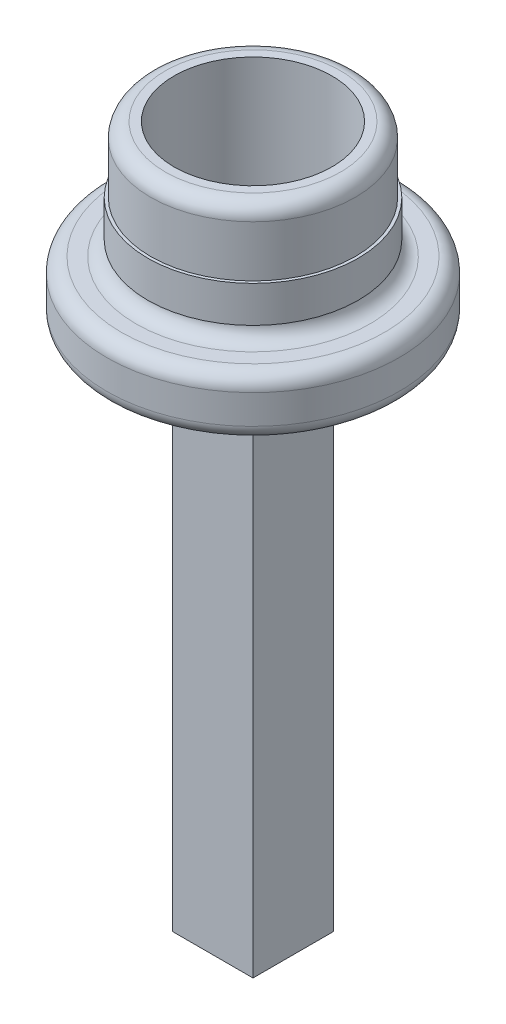
ISO-10303-21;
HEADER;
FILE_DESCRIPTION(('STEP AP214'),'2;1');
FILE_NAME('part.step','',(''),(''),'','','');
FILE_SCHEMA(('AUTOMOTIVE_DESIGN { 1 0 10303 214 1 1 1 1 }'));
ENDSEC;
DATA;
#1=APPLICATION_CONTEXT('core data for automotive mechanical design processes');
#2=APPLICATION_PROTOCOL_DEFINITION('international standard','automotive_design',2000,#1);
#3=PRODUCT_CONTEXT('',#1,'mechanical');
#4=PRODUCT('Part','Part','',(#3));
#5=PRODUCT_RELATED_PRODUCT_CATEGORY('part','',(#4));
#6=PRODUCT_DEFINITION_FORMATION('','',#4);
#7=PRODUCT_DEFINITION_CONTEXT('part definition',#1,'design');
#8=PRODUCT_DEFINITION('design','',#6,#7);
#9=PRODUCT_DEFINITION_SHAPE('','',#8);
#10=(LENGTH_UNIT() NAMED_UNIT(*) SI_UNIT(.MILLI.,.METRE.));
#11=(NAMED_UNIT(*) PLANE_ANGLE_UNIT() SI_UNIT($,.RADIAN.));
#12=(NAMED_UNIT(*) SI_UNIT($,.STERADIAN.) SOLID_ANGLE_UNIT());
#13=UNCERTAINTY_MEASURE_WITH_UNIT(LENGTH_MEASURE(1.E-05),#10,'distance_accuracy_value','');
#14=(GEOMETRIC_REPRESENTATION_CONTEXT(3) GLOBAL_UNCERTAINTY_ASSIGNED_CONTEXT((#13)) GLOBAL_UNIT_ASSIGNED_CONTEXT((#10,
#11,#12)) REPRESENTATION_CONTEXT('',''));
#15=CARTESIAN_POINT('',(0.,0.,0.));
#16=DIRECTION('',(0.,0.,1.));
#17=DIRECTION('',(1.,0.,0.));
#18=AXIS2_PLACEMENT_3D('',#15,#16,#17);
#19=CARTESIAN_POINT('',(-5.93361483411232E-06,-2.56436574363047,-1.69584897440673E-05));
#20=DIRECTION('',(0.,1.,0.));
#21=DIRECTION('',(0.,0.,1.));
#22=AXIS2_PLACEMENT_3D('',#19,#20,#21);
#23=PLANE('',#22);
#24=CARTESIAN_POINT('',(-5.93361483411232E-06,-2.56436574363047,-1.69584897440673E-05));
#25=DIRECTION('',(0.,1.,0.));
#26=DIRECTION('',(0.,0.,1.));
#27=AXIS2_PLACEMENT_3D('',#24,#25,#26);
#28=CIRCLE('',#27,18.);
#29=CARTESIAN_POINT('',(-5.93361483411232E-06,-2.56436574363047,17.9999830415103));
#30=VERTEX_POINT('',#29);
#31=EDGE_CURVE('E170',#30,#30,#28,.F.);
#32=ORIENTED_EDGE('',*,*,#31,.T.);
#33=EDGE_LOOP('',(#32));
#34=FACE_BOUND('',#33,.T.);
#35=DIRECTION('',(0.,0.,1.));
#36=VECTOR('',#35,1.);
#37=CARTESIAN_POINT('',(5.49999406638516,-2.56436574363047,5.49998304151026));
#38=LINE('',#37,#36);
#39=CARTESIAN_POINT('',(5.49999406638517,-2.56436574363047,-5.50001695848974));
#40=VERTEX_POINT('',#39);
#41=CARTESIAN_POINT('',(5.49999406638516,-2.56436574363047,5.49998304151026));
#42=VERTEX_POINT('',#41);
#43=EDGE_CURVE('E134',#40,#42,#38,.T.);
#44=ORIENTED_EDGE('',*,*,#43,.F.);
#45=DIRECTION('',(1.,0.,0.));
#46=VECTOR('',#45,1.);
#47=CARTESIAN_POINT('',(-5.50000593361484,-2.56436574363047,-5.50001695848974));
#48=LINE('',#47,#46);
#49=CARTESIAN_POINT('',(-5.50000593361484,-2.56436574363047,-5.50001695848974));
#50=VERTEX_POINT('',#49);
#51=EDGE_CURVE('E242',#50,#40,#48,.T.);
#52=ORIENTED_EDGE('',*,*,#51,.F.);
#53=DIRECTION('',(0.,0.,-1.));
#54=VECTOR('',#53,1.);
#55=CARTESIAN_POINT('',(-5.50000593361484,-2.56436574363047,5.49998304151026));
#56=LINE('',#55,#54);
#57=CARTESIAN_POINT('',(-5.50000593361484,-2.56436574363047,5.49998304151026));
#58=VERTEX_POINT('',#57);
#59=EDGE_CURVE('E238',#58,#50,#56,.T.);
#60=ORIENTED_EDGE('',*,*,#59,.F.);
#61=DIRECTION('',(-1.,0.,0.));
#62=VECTOR('',#61,1.);
#63=CARTESIAN_POINT('',(-5.50000593361484,-2.56436574363047,5.49998304151026));
#64=LINE('',#63,#62);
#65=EDGE_CURVE('E235',#42,#58,#64,.T.);
#66=ORIENTED_EDGE('',*,*,#65,.F.);
#67=EDGE_LOOP('',(#44,#52,#60,#66));
#68=FACE_BOUND('',#67,.T.);
#69=ADVANCED_FACE('F73',(#34,#68),#23,.F.);
#70=CARTESIAN_POINT('',(-5.93361483411232E-06,5.43563425636953,-1.69584897440673E-05));
#71=DIRECTION('',(0.,-1.,0.));
#72=DIRECTION('',(0.,0.,-1.));
#73=AXIS2_PLACEMENT_3D('',#70,#71,#72);
#74=CYLINDRICAL_SURFACE('',#73,20.);
#75=CARTESIAN_POINT('',(-5.93361483411232E-06,-0.564365743630474,-1.69584897440673E-05));
#76=DIRECTION('',(0.,1.,0.));
#77=DIRECTION('',(0.,0.,1.));
#78=AXIS2_PLACEMENT_3D('',#75,#76,#77);
#79=CIRCLE('',#78,20.);
#80=CARTESIAN_POINT('',(-5.93361483411232E-06,-0.564365743630474,19.9999830415103));
#81=VERTEX_POINT('',#80);
#82=EDGE_CURVE('E166',#81,#81,#79,.T.);
#83=ORIENTED_EDGE('',*,*,#82,.T.);
#84=EDGE_LOOP('',(#83));
#85=FACE_BOUND('',#84,.T.);
#86=CARTESIAN_POINT('',(-5.93361483411232E-06,3.43563425636953,-1.69584897440673E-05));
#87=DIRECTION('',(0.,1.,0.));
#88=DIRECTION('',(0.,0.,1.));
#89=AXIS2_PLACEMENT_3D('',#86,#87,#88);
#90=CIRCLE('',#89,20.);
#91=CARTESIAN_POINT('',(-5.93361483411232E-06,3.43563425636953,19.9999830415103));
#92=VERTEX_POINT('',#91);
#93=EDGE_CURVE('E162',#92,#92,#90,.F.);
#94=ORIENTED_EDGE('',*,*,#93,.T.);
#95=EDGE_LOOP('',(#94));
#96=FACE_BOUND('',#95,.T.);
#97=ADVANCED_FACE('F263',(#85,#96),#74,.T.);
#98=CARTESIAN_POINT('',(-5.93361483411232E-06,5.43563425636953,-1.69584897440673E-05));
#99=DIRECTION('',(0.,1.,0.));
#100=DIRECTION('',(0.,0.,1.));
#101=AXIS2_PLACEMENT_3D('',#98,#99,#100);
#102=PLANE('',#101);
#103=CARTESIAN_POINT('',(-5.93361483411232E-06,5.43563425636953,-1.69584897440673E-05));
#104=DIRECTION('',(0.,1.,0.));
#105=DIRECTION('',(0.,0.,1.));
#106=AXIS2_PLACEMENT_3D('',#103,#104,#105);
#107=CIRCLE('',#106,16.);
#108=CARTESIAN_POINT('',(-5.93361483411232E-06,5.43563425636953,15.9999830415103));
#109=VERTEX_POINT('',#108);
#110=EDGE_CURVE('E158',#109,#109,#107,.F.);
#111=ORIENTED_EDGE('',*,*,#110,.T.);
#112=EDGE_LOOP('',(#111));
#113=FACE_BOUND('',#112,.T.);
#114=CARTESIAN_POINT('',(-5.93361483411232E-06,5.43563425636953,-1.69584897440673E-05));
#115=DIRECTION('',(0.,1.,0.));
#116=DIRECTION('',(0.,0.,1.));
#117=AXIS2_PLACEMENT_3D('',#114,#115,#116);
#118=CIRCLE('',#117,18.);
#119=CARTESIAN_POINT('',(-5.93361483411232E-06,5.43563425636953,17.9999830415103));
#120=VERTEX_POINT('',#119);
#121=EDGE_CURVE('E154',#120,#120,#118,.T.);
#122=ORIENTED_EDGE('',*,*,#121,.T.);
#123=EDGE_LOOP('',(#122));
#124=FACE_BOUND('',#123,.T.);
#125=ADVANCED_FACE('F269',(#113,#124),#102,.T.);
#126=CARTESIAN_POINT('',(5.49999406638516,-82.5643657436305,5.49998304151026));
#127=DIRECTION('',(-1.,0.,0.));
#128=DIRECTION('',(0.,0.,1.));
#129=AXIS2_PLACEMENT_3D('',#126,#127,#128);
#130=PLANE('',#129);
#131=DIRECTION('',(0.,1.,0.));
#132=VECTOR('',#131,1.);
#133=CARTESIAN_POINT('',(5.49999406638516,-82.5643657436305,5.49998304151026));
#134=LINE('',#133,#132);
#135=CARTESIAN_POINT('',(5.49999406638516,-74.5643657436305,5.49998304151026));
#136=VERTEX_POINT('',#135);
#137=EDGE_CURVE('E128',#136,#42,#134,.T.);
#138=ORIENTED_EDGE('',*,*,#137,.F.);
#139=DIRECTION('',(0.,0.,1.));
#140=VECTOR('',#139,1.);
#141=CARTESIAN_POINT('',(5.49999406638516,-74.5643657436305,-5.50001695848974));
#142=LINE('',#141,#140);
#143=CARTESIAN_POINT('',(5.49999406638516,-74.5643657436305,-5.50001695848974));
#144=VERTEX_POINT('',#143);
#145=EDGE_CURVE('E116',#144,#136,#142,.T.);
#146=ORIENTED_EDGE('',*,*,#145,.F.);
#147=DIRECTION('',(0.,1.,0.));
#148=VECTOR('',#147,1.);
#149=CARTESIAN_POINT('',(5.49999406638517,-82.5643657436305,-5.50001695848974));
#150=LINE('',#149,#148);
#151=EDGE_CURVE('E99',#144,#40,#150,.T.);
#152=ORIENTED_EDGE('',*,*,#151,.T.);
#153=ORIENTED_EDGE('',*,*,#43,.T.);
#154=EDGE_LOOP('',(#138,#146,#152,#153));
#155=FACE_BOUND('',#154,.T.);
#156=ADVANCED_FACE('F133',(#155),#130,.F.);
#157=CARTESIAN_POINT('',(-5.50000593361484,-82.5643657436305,5.49998304151026));
#158=DIRECTION('',(0.,0.,-1.));
#159=DIRECTION('',(-1.,0.,0.));
#160=AXIS2_PLACEMENT_3D('',#157,#158,#159);
#161=PLANE('',#160);
#162=DIRECTION('',(0.,1.,0.));
#163=VECTOR('',#162,1.);
#164=CARTESIAN_POINT('',(-5.50000593361484,-82.5643657436305,5.49998304151026));
#165=LINE('',#164,#163);
#166=CARTESIAN_POINT('',(-5.50000593361483,-74.5643657436305,5.49998304151026));
#167=VERTEX_POINT('',#166);
#168=EDGE_CURVE('E130',#167,#58,#165,.T.);
#169=ORIENTED_EDGE('',*,*,#168,.F.);
#170=DIRECTION('',(-1.,0.,0.));
#171=VECTOR('',#170,1.);
#172=CARTESIAN_POINT('',(-5.50000593361483,-74.5643657436305,5.49998304151026));
#173=LINE('',#172,#171);
#174=EDGE_CURVE('E119',#136,#167,#173,.T.);
#175=ORIENTED_EDGE('',*,*,#174,.F.);
#176=ORIENTED_EDGE('',*,*,#137,.T.);
#177=ORIENTED_EDGE('',*,*,#65,.T.);
#178=EDGE_LOOP('',(#169,#175,#176,#177));
#179=FACE_BOUND('',#178,.T.);
#180=ADVANCED_FACE('F126',(#179),#161,.F.);
#181=CARTESIAN_POINT('',(-5.50000593361484,-82.5643657436305,5.49998304151026));
#182=DIRECTION('',(1.,0.,0.));
#183=DIRECTION('',(0.,0.,-1.));
#184=AXIS2_PLACEMENT_3D('',#181,#182,#183);
#185=PLANE('',#184);
#186=DIRECTION('',(0.,1.,0.));
#187=VECTOR('',#186,1.);
#188=CARTESIAN_POINT('',(-5.50000593361484,-82.5643657436305,-5.50001695848974));
#189=LINE('',#188,#187);
#190=CARTESIAN_POINT('',(-5.50000593361484,-74.5643657436305,-5.50001695848974));
#191=VERTEX_POINT('',#190);
#192=EDGE_CURVE('E143',#191,#50,#189,.T.);
#193=ORIENTED_EDGE('',*,*,#192,.F.);
#194=DIRECTION('',(0.,0.,-1.));
#195=VECTOR('',#194,1.);
#196=CARTESIAN_POINT('',(-5.50000593361483,-74.5643657436305,-5.50001695848974));
#197=LINE('',#196,#195);
#198=EDGE_CURVE('E91',#167,#191,#197,.T.);
#199=ORIENTED_EDGE('',*,*,#198,.F.);
#200=ORIENTED_EDGE('',*,*,#168,.T.);
#201=ORIENTED_EDGE('',*,*,#59,.T.);
#202=EDGE_LOOP('',(#193,#199,#200,#201));
#203=FACE_BOUND('',#202,.T.);
#204=ADVANCED_FACE('F254',(#203),#185,.F.);
#205=CARTESIAN_POINT('',(-5.50000593361484,-82.5643657436305,-5.50001695848974));
#206=DIRECTION('',(0.,0.,1.));
#207=DIRECTION('',(1.,0.,0.));
#208=AXIS2_PLACEMENT_3D('',#205,#206,#207);
#209=PLANE('',#208);
#210=ORIENTED_EDGE('',*,*,#151,.F.);
#211=DIRECTION('',(1.,0.,0.));
#212=VECTOR('',#211,1.);
#213=CARTESIAN_POINT('',(-5.50000593361483,-74.5643657436305,-5.50001695848974));
#214=LINE('',#213,#212);
#215=EDGE_CURVE('E120',#191,#144,#214,.T.);
#216=ORIENTED_EDGE('',*,*,#215,.F.);
#217=ORIENTED_EDGE('',*,*,#192,.T.);
#218=ORIENTED_EDGE('',*,*,#51,.T.);
#219=EDGE_LOOP('',(#210,#216,#217,#218));
#220=FACE_BOUND('',#219,.T.);
#221=ADVANCED_FACE('F223',(#220),#209,.F.);
#222=CARTESIAN_POINT('',(-5.93361483411232E-06,7.43563425636953,-1.69584897440673E-05));
#223=DIRECTION('',(0.,1.,0.));
#224=DIRECTION('',(0.,0.,1.));
#225=AXIS2_PLACEMENT_3D('',#222,#223,#224);
#226=TOROIDAL_SURFACE('',#225,16.,2.);
#227=ORIENTED_EDGE('',*,*,#110,.F.);
#228=EDGE_LOOP('',(#227));
#229=FACE_BOUND('',#228,.T.);
#230=CARTESIAN_POINT('',(-5.93361483411232E-06,7.43563425636953,-1.69584897440673E-05));
#231=DIRECTION('',(0.,1.,0.));
#232=DIRECTION('',(0.,0.,1.));
#233=AXIS2_PLACEMENT_3D('',#230,#231,#232);
#234=CIRCLE('',#233,14.);
#235=CARTESIAN_POINT('',(-5.93361483411232E-06,7.43563425636953,13.9999830415103));
#236=VERTEX_POINT('',#235);
#237=EDGE_CURVE('E149',#236,#236,#234,.T.);
#238=ORIENTED_EDGE('',*,*,#237,.F.);
#239=EDGE_LOOP('',(#238));
#240=FACE_BOUND('',#239,.T.);
#241=ADVANCED_FACE('F260',(#229,#240),#226,.F.);
#242=CARTESIAN_POINT('',(-5.93361483411232E-06,-0.564365743630474,-1.69584897440673E-05));
#243=DIRECTION('',(0.,1.,0.));
#244=DIRECTION('',(0.,0.,1.));
#245=AXIS2_PLACEMENT_3D('',#242,#243,#244);
#246=TOROIDAL_SURFACE('',#245,18.,2.);
#247=ORIENTED_EDGE('',*,*,#31,.F.);
#248=EDGE_LOOP('',(#247));
#249=FACE_BOUND('',#248,.T.);
#250=ORIENTED_EDGE('',*,*,#82,.F.);
#251=EDGE_LOOP('',(#250));
#252=FACE_BOUND('',#251,.T.);
#253=ADVANCED_FACE('F277',(#249,#252),#246,.T.);
#254=CARTESIAN_POINT('',(-5.93361483411232E-06,3.43563425636953,-1.69584897440673E-05));
#255=DIRECTION('',(0.,1.,0.));
#256=DIRECTION('',(0.,0.,1.));
#257=AXIS2_PLACEMENT_3D('',#254,#255,#256);
#258=TOROIDAL_SURFACE('',#257,18.,2.);
#259=ORIENTED_EDGE('',*,*,#93,.F.);
#260=EDGE_LOOP('',(#259));
#261=FACE_BOUND('',#260,.T.);
#262=ORIENTED_EDGE('',*,*,#121,.F.);
#263=EDGE_LOOP('',(#262));
#264=FACE_BOUND('',#263,.T.);
#265=ADVANCED_FACE('F217',(#261,#264),#258,.T.);
#266=CARTESIAN_POINT('',(-5.93361483411232E-06,7.43563425636953,-1.69584897440673E-05));
#267=DIRECTION('',(0.,-1.,0.));
#268=DIRECTION('',(0.,0.,-1.));
#269=AXIS2_PLACEMENT_3D('',#266,#267,#268);
#270=PLANE('',#269);
#271=CARTESIAN_POINT('',(-5.93361483411232E-06,7.43563425636953,-1.69584897440673E-05));
#272=DIRECTION('',(0.,-1.,0.));
#273=DIRECTION('',(0.,0.,-1.));
#274=AXIS2_PLACEMENT_3D('',#271,#272,#273);
#275=CIRCLE('',#274,14.4);
#276=CARTESIAN_POINT('',(-5.93361483411232E-06,7.43563425636953,-14.4000169584897));
#277=VERTEX_POINT('',#276);
#278=EDGE_CURVE('E179',#277,#277,#275,.F.);
#279=ORIENTED_EDGE('',*,*,#278,.F.);
#280=EDGE_LOOP('',(#279));
#281=FACE_BOUND('',#280,.T.);
#282=ORIENTED_EDGE('',*,*,#237,.T.);
#283=EDGE_LOOP('',(#282));
#284=FACE_BOUND('',#283,.T.);
#285=ADVANCED_FACE('F214',(#281,#284),#270,.T.);
#286=CARTESIAN_POINT('',(-5.93361483411232E-06,12.4233889527558,-1.69584897440673E-05));
#287=DIRECTION('',(0.,1.,0.));
#288=DIRECTION('',(0.,0.,1.));
#289=AXIS2_PLACEMENT_3D('',#286,#287,#288);
#290=PLANE('',#289);
#291=CARTESIAN_POINT('',(-5.93361483411232E-06,12.4233889527558,-1.69584897440673E-05));
#292=DIRECTION('',(0.,-1.,0.));
#293=DIRECTION('',(0.,0.,-1.));
#294=AXIS2_PLACEMENT_3D('',#291,#292,#293);
#295=CIRCLE('',#294,14.4);
#296=CARTESIAN_POINT('',(-5.93361483411232E-06,12.4233889527558,-14.4000169584897));
#297=VERTEX_POINT('',#296);
#298=EDGE_CURVE('E186',#297,#297,#295,.T.);
#299=ORIENTED_EDGE('',*,*,#298,.F.);
#300=EDGE_LOOP('',(#299));
#301=FACE_BOUND('',#300,.T.);
#302=CARTESIAN_POINT('',(-5.93361483411232E-06,12.4233889527558,-1.69584897440673E-05));
#303=DIRECTION('',(0.,-1.,0.));
#304=DIRECTION('',(0.,0.,-1.));
#305=AXIS2_PLACEMENT_3D('',#302,#303,#304);
#306=CIRCLE('',#305,14.);
#307=CARTESIAN_POINT('',(-5.93361483411232E-06,12.4233889527558,-14.0000169584898));
#308=VERTEX_POINT('',#307);
#309=EDGE_CURVE('E176',#308,#308,#306,.T.);
#310=ORIENTED_EDGE('',*,*,#309,.T.);
#311=EDGE_LOOP('',(#310));
#312=FACE_BOUND('',#311,.T.);
#313=ADVANCED_FACE('F212',(#301,#312),#290,.T.);
#314=CARTESIAN_POINT('',(-5.93361483411232E-06,21.4356342563695,-1.69584897440673E-05));
#315=DIRECTION('',(0.,-1.,0.));
#316=DIRECTION('',(0.,0.,-1.));
#317=AXIS2_PLACEMENT_3D('',#314,#315,#316);
#318=CYLINDRICAL_SURFACE('',#317,14.4);
#319=ORIENTED_EDGE('',*,*,#278,.T.);
#320=EDGE_LOOP('',(#319));
#321=FACE_BOUND('',#320,.T.);
#322=ORIENTED_EDGE('',*,*,#298,.T.);
#323=EDGE_LOOP('',(#322));
#324=FACE_BOUND('',#323,.T.);
#325=ADVANCED_FACE('F201',(#321,#324),#318,.T.);
#326=CARTESIAN_POINT('',(-5.93361483411232E-06,1.43563425636952,-1.69584897440673E-05));
#327=DIRECTION('',(0.,1.,0.));
#328=DIRECTION('',(0.,0.,1.));
#329=AXIS2_PLACEMENT_3D('',#326,#327,#328);
#330=PLANE('',#329);
#331=CARTESIAN_POINT('',(-5.93361483411232E-06,1.43563425636952,-1.69584897440673E-05));
#332=DIRECTION('',(0.,1.,0.));
#333=DIRECTION('',(0.,0.,1.));
#334=AXIS2_PLACEMENT_3D('',#331,#332,#333);
#335=CIRCLE('',#334,10.8);
#336=CARTESIAN_POINT('',(-5.93361483411232E-06,1.43563425636952,10.7999830415103));
#337=VERTEX_POINT('',#336);
#338=EDGE_CURVE('E141',#337,#337,#335,.T.);
#339=ORIENTED_EDGE('',*,*,#338,.T.);
#340=EDGE_LOOP('',(#339));
#341=FACE_BOUND('',#340,.T.);
#342=ADVANCED_FACE('F211',(#341),#330,.T.);
#343=CARTESIAN_POINT('',(-5.93361483411232E-06,1.43563425636952,-1.69584897440673E-05));
#344=DIRECTION('',(0.,1.,0.));
#345=DIRECTION('',(0.,0.,1.));
#346=AXIS2_PLACEMENT_3D('',#343,#344,#345);
#347=CYLINDRICAL_SURFACE('',#346,10.8);
#348=ORIENTED_EDGE('',*,*,#338,.F.);
#349=EDGE_LOOP('',(#348));
#350=FACE_BOUND('',#349,.T.);
#351=CARTESIAN_POINT('',(-5.93361483411232E-06,21.4356342563695,-1.69584897440673E-05));
#352=DIRECTION('',(0.,1.,0.));
#353=DIRECTION('',(0.,0.,1.));
#354=AXIS2_PLACEMENT_3D('',#351,#352,#353);
#355=CIRCLE('',#354,10.8);
#356=CARTESIAN_POINT('',(-5.93361483411232E-06,21.4356342563695,10.7999830415103));
#357=VERTEX_POINT('',#356);
#358=EDGE_CURVE('E136',#357,#357,#355,.T.);
#359=ORIENTED_EDGE('',*,*,#358,.T.);
#360=EDGE_LOOP('',(#359));
#361=FACE_BOUND('',#360,.T.);
#362=ADVANCED_FACE('F304',(#350,#361),#347,.F.);
#363=CARTESIAN_POINT('',(-5.93361483411232E-06,21.4356342563695,-1.69584897440673E-05));
#364=DIRECTION('',(0.,1.,0.));
#365=DIRECTION('',(0.,0.,1.));
#366=AXIS2_PLACEMENT_3D('',#363,#364,#365);
#367=PLANE('',#366);
#368=CARTESIAN_POINT('',(-5.93361483411232E-06,21.4356342563695,-1.69584897440673E-05));
#369=DIRECTION('',(0.,1.,0.));
#370=DIRECTION('',(0.,0.,1.));
#371=AXIS2_PLACEMENT_3D('',#368,#369,#370);
#372=CIRCLE('',#371,12.);
#373=CARTESIAN_POINT('',(-5.93361483411232E-06,21.4356342563695,11.9999830415103));
#374=VERTEX_POINT('',#373);
#375=EDGE_CURVE('E83',#374,#374,#372,.T.);
#376=ORIENTED_EDGE('',*,*,#375,.T.);
#377=EDGE_LOOP('',(#376));
#378=FACE_BOUND('',#377,.T.);
#379=ORIENTED_EDGE('',*,*,#358,.F.);
#380=EDGE_LOOP('',(#379));
#381=FACE_BOUND('',#380,.T.);
#382=ADVANCED_FACE('F308',(#378,#381),#367,.T.);
#383=CARTESIAN_POINT('',(-5.93361483411232E-06,19.4356342563695,-1.69584897440673E-05));
#384=DIRECTION('',(0.,1.,0.));
#385=DIRECTION('',(0.,0.,1.));
#386=AXIS2_PLACEMENT_3D('',#383,#384,#385);
#387=TOROIDAL_SURFACE('',#386,12.,2.);
#388=CARTESIAN_POINT('',(-5.93361483411232E-06,19.4356342563695,-1.69584897440673E-05));
#389=DIRECTION('',(0.,1.,0.));
#390=DIRECTION('',(0.,0.,1.));
#391=AXIS2_PLACEMENT_3D('',#388,#389,#390);
#392=CIRCLE('',#391,14.);
#393=CARTESIAN_POINT('',(-5.93361483411232E-06,19.4356342563695,13.9999830415103));
#394=VERTEX_POINT('',#393);
#395=EDGE_CURVE('E14',#394,#394,#392,.F.);
#396=ORIENTED_EDGE('',*,*,#395,.F.);
#397=EDGE_LOOP('',(#396));
#398=FACE_BOUND('',#397,.T.);
#399=ORIENTED_EDGE('',*,*,#375,.F.);
#400=EDGE_LOOP('',(#399));
#401=FACE_BOUND('',#400,.T.);
#402=ADVANCED_FACE('F75',(#398,#401),#387,.T.);
#403=CARTESIAN_POINT('',(-5.93361483411232E-06,21.4356342563695,-1.69584897440673E-05));
#404=DIRECTION('',(0.,-1.,0.));
#405=DIRECTION('',(0.,0.,-1.));
#406=AXIS2_PLACEMENT_3D('',#403,#404,#405);
#407=CYLINDRICAL_SURFACE('',#406,14.);
#408=ORIENTED_EDGE('',*,*,#309,.F.);
#409=EDGE_LOOP('',(#408));
#410=FACE_BOUND('',#409,.T.);
#411=ORIENTED_EDGE('',*,*,#395,.T.);
#412=EDGE_LOOP('',(#411));
#413=FACE_BOUND('',#412,.T.);
#414=ADVANCED_FACE('F312',(#410,#413),#407,.T.);
#415=CARTESIAN_POINT('',(-5.93361483411232E-06,-74.5643657436305,-1.69584897440673E-05));
#416=DIRECTION('',(0.,1.,0.));
#417=DIRECTION('',(0.,0.,1.));
#418=AXIS2_PLACEMENT_3D('',#415,#416,#417);
#419=PLANE('',#418);
#420=ORIENTED_EDGE('',*,*,#145,.T.);
#421=ORIENTED_EDGE('',*,*,#174,.T.);
#422=ORIENTED_EDGE('',*,*,#198,.T.);
#423=ORIENTED_EDGE('',*,*,#215,.T.);
#424=EDGE_LOOP('',(#420,#421,#422,#423));
#425=FACE_BOUND('',#424,.T.);
#426=ADVANCED_FACE('F118',(#425),#419,.F.);
#427=CLOSED_SHELL('',(#69,#97,#125,#156,#180,#204,#221,#241,#253,#265,#285,#313,#325,#342,#362,
#382,#402,#414,#426));
#428=MANIFOLD_SOLID_BREP('B2',#427);
#429=ADVANCED_BREP_SHAPE_REPRESENTATION('',(#18,#428),#14);
#430=SHAPE_DEFINITION_REPRESENTATION(#9,#429);
ENDSEC;
END-ISO-10303-21;
